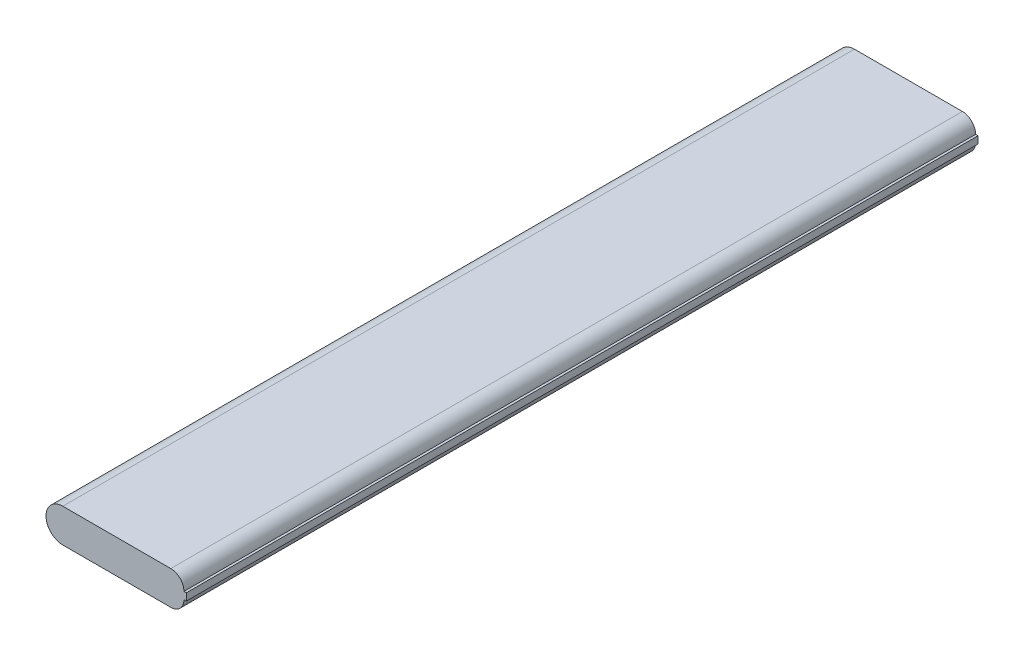
ISO-10303-21;
HEADER;
FILE_DESCRIPTION(('STEP AP214'),'2;1');
FILE_NAME('part.step','',(''),(''),'','','');
FILE_SCHEMA(('AUTOMOTIVE_DESIGN { 1 0 10303 214 1 1 1 1 }'));
ENDSEC;
DATA;
#1=APPLICATION_CONTEXT('core data for automotive mechanical design processes');
#2=APPLICATION_PROTOCOL_DEFINITION('international standard','automotive_design',2000,#1);
#3=PRODUCT_CONTEXT('',#1,'mechanical');
#4=PRODUCT('Part','Part','',(#3));
#5=PRODUCT_RELATED_PRODUCT_CATEGORY('part','',(#4));
#6=PRODUCT_DEFINITION_FORMATION('','',#4);
#7=PRODUCT_DEFINITION_CONTEXT('part definition',#1,'design');
#8=PRODUCT_DEFINITION('design','',#6,#7);
#9=PRODUCT_DEFINITION_SHAPE('','',#8);
#10=(LENGTH_UNIT() NAMED_UNIT(*) SI_UNIT(.MILLI.,.METRE.));
#11=(NAMED_UNIT(*) PLANE_ANGLE_UNIT() SI_UNIT($,.RADIAN.));
#12=(NAMED_UNIT(*) SI_UNIT($,.STERADIAN.) SOLID_ANGLE_UNIT());
#13=UNCERTAINTY_MEASURE_WITH_UNIT(LENGTH_MEASURE(1.E-05),#10,'distance_accuracy_value','');
#14=(GEOMETRIC_REPRESENTATION_CONTEXT(3) GLOBAL_UNCERTAINTY_ASSIGNED_CONTEXT((#13)) GLOBAL_UNIT_ASSIGNED_CONTEXT((#10,
#11,#12)) REPRESENTATION_CONTEXT('',''));
#15=CARTESIAN_POINT('',(0.,0.,0.));
#16=DIRECTION('',(0.,0.,1.));
#17=DIRECTION('',(1.,0.,0.));
#18=AXIS2_PLACEMENT_3D('',#15,#16,#17);
#19=CARTESIAN_POINT('',(-11.25,0.,82.5));
#20=DIRECTION('',(0.,0.,-1.));
#21=DIRECTION('',(-1.,0.,0.));
#22=AXIS2_PLACEMENT_3D('',#19,#20,#21);
#23=CYLINDRICAL_SURFACE('',#22,3.5);
#24=CARTESIAN_POINT('',(-11.25,0.,-82.5));
#25=DIRECTION('',(0.,0.,1.));
#26=DIRECTION('',(1.,0.,0.));
#27=AXIS2_PLACEMENT_3D('',#24,#25,#26);
#28=CIRCLE('',#27,3.5);
#29=CARTESIAN_POINT('',(-11.25,3.5,-82.5));
#30=VERTEX_POINT('',#29);
#31=CARTESIAN_POINT('',(-11.25,-3.5,-82.5));
#32=VERTEX_POINT('',#31);
#33=EDGE_CURVE('E130',#30,#32,#28,.T.);
#34=ORIENTED_EDGE('',*,*,#33,.T.);
#35=DIRECTION('',(0.,0.,-1.));
#36=VECTOR('',#35,1.);
#37=CARTESIAN_POINT('',(-11.25,-3.5,82.5));
#38=LINE('',#37,#36);
#39=CARTESIAN_POINT('',(-11.25,-3.5,82.5));
#40=VERTEX_POINT('',#39);
#41=EDGE_CURVE('E11',#40,#32,#38,.T.);
#42=ORIENTED_EDGE('',*,*,#41,.F.);
#43=CARTESIAN_POINT('',(-11.25,0.,82.5));
#44=DIRECTION('',(0.,0.,1.));
#45=DIRECTION('',(1.,0.,0.));
#46=AXIS2_PLACEMENT_3D('',#43,#44,#45);
#47=CIRCLE('',#46,3.5);
#48=CARTESIAN_POINT('',(-11.25,3.5,82.5));
#49=VERTEX_POINT('',#48);
#50=EDGE_CURVE('E144',#49,#40,#47,.T.);
#51=ORIENTED_EDGE('',*,*,#50,.F.);
#52=DIRECTION('',(0.,0.,-1.));
#53=VECTOR('',#52,1.);
#54=CARTESIAN_POINT('',(-11.25,3.5,82.5));
#55=LINE('',#54,#53);
#56=EDGE_CURVE('E126',#49,#30,#55,.T.);
#57=ORIENTED_EDGE('',*,*,#56,.T.);
#58=EDGE_LOOP('',(#34,#42,#51,#57));
#59=FACE_BOUND('',#58,.T.);
#60=ADVANCED_FACE('F34',(#59),#23,.T.);
#61=CARTESIAN_POINT('',(-11.25,-3.5,82.5));
#62=DIRECTION('',(0.,1.,0.));
#63=DIRECTION('',(0.,0.,1.));
#64=AXIS2_PLACEMENT_3D('',#61,#62,#63);
#65=PLANE('',#64);
#66=DIRECTION('',(1.,0.,0.));
#67=VECTOR('',#66,1.);
#68=CARTESIAN_POINT('',(-11.25,-3.5,-82.5));
#69=LINE('',#68,#67);
#70=CARTESIAN_POINT('',(11.25,-3.5,-82.5));
#71=VERTEX_POINT('',#70);
#72=EDGE_CURVE('E133',#32,#71,#69,.T.);
#73=ORIENTED_EDGE('',*,*,#72,.T.);
#74=DIRECTION('',(0.,0.,-1.));
#75=VECTOR('',#74,1.);
#76=CARTESIAN_POINT('',(11.25,-3.5,82.5));
#77=LINE('',#76,#75);
#78=CARTESIAN_POINT('',(11.25,-3.5,82.5));
#79=VERTEX_POINT('',#78);
#80=EDGE_CURVE('E42',#79,#71,#77,.T.);
#81=ORIENTED_EDGE('',*,*,#80,.F.);
#82=DIRECTION('',(1.,0.,0.));
#83=VECTOR('',#82,1.);
#84=CARTESIAN_POINT('',(-11.25,-3.5,82.5));
#85=LINE('',#84,#83);
#86=EDGE_CURVE('E93',#40,#79,#85,.T.);
#87=ORIENTED_EDGE('',*,*,#86,.F.);
#88=ORIENTED_EDGE('',*,*,#41,.T.);
#89=EDGE_LOOP('',(#73,#81,#87,#88));
#90=FACE_BOUND('',#89,.T.);
#91=ADVANCED_FACE('F179',(#90),#65,.F.);
#92=CARTESIAN_POINT('',(11.25,-0.75,82.5));
#93=DIRECTION('',(0.,0.,-1.));
#94=DIRECTION('',(-1.,0.,0.));
#95=AXIS2_PLACEMENT_3D('',#92,#93,#94);
#96=CYLINDRICAL_SURFACE('',#95,2.75);
#97=CARTESIAN_POINT('',(11.25,-0.75,-82.5));
#98=DIRECTION('',(0.,0.,1.));
#99=DIRECTION('',(1.,0.,0.));
#100=AXIS2_PLACEMENT_3D('',#97,#98,#99);
#101=CIRCLE('',#100,2.75);
#102=CARTESIAN_POINT('',(14.,-0.75,-82.5));
#103=VERTEX_POINT('',#102);
#104=EDGE_CURVE('E135',#71,#103,#101,.T.);
#105=ORIENTED_EDGE('',*,*,#104,.T.);
#106=DIRECTION('',(0.,0.,-1.));
#107=VECTOR('',#106,1.);
#108=CARTESIAN_POINT('',(14.,-0.75,82.5));
#109=LINE('',#108,#107);
#110=CARTESIAN_POINT('',(14.,-0.75,82.5));
#111=VERTEX_POINT('',#110);
#112=EDGE_CURVE('E151',#111,#103,#109,.T.);
#113=ORIENTED_EDGE('',*,*,#112,.F.);
#114=CARTESIAN_POINT('',(11.25,-0.75,82.5));
#115=DIRECTION('',(0.,0.,1.));
#116=DIRECTION('',(1.,0.,0.));
#117=AXIS2_PLACEMENT_3D('',#114,#115,#116);
#118=CIRCLE('',#117,2.75);
#119=EDGE_CURVE('E159',#79,#111,#118,.T.);
#120=ORIENTED_EDGE('',*,*,#119,.F.);
#121=ORIENTED_EDGE('',*,*,#80,.T.);
#122=EDGE_LOOP('',(#105,#113,#120,#121));
#123=FACE_BOUND('',#122,.T.);
#124=ADVANCED_FACE('F157',(#123),#96,.T.);
#125=CARTESIAN_POINT('',(14.,-0.75,82.5));
#126=DIRECTION('',(0.,1.,0.));
#127=DIRECTION('',(-1.,0.,0.));
#128=AXIS2_PLACEMENT_3D('',#125,#126,#127);
#129=PLANE('',#128);
#130=DIRECTION('',(1.,0.,0.));
#131=VECTOR('',#130,1.);
#132=CARTESIAN_POINT('',(14.,-0.75,-82.5));
#133=LINE('',#132,#131);
#134=CARTESIAN_POINT('',(14.5,-0.75,-82.5));
#135=VERTEX_POINT('',#134);
#136=EDGE_CURVE('E137',#103,#135,#133,.T.);
#137=ORIENTED_EDGE('',*,*,#136,.T.);
#138=DIRECTION('',(0.,0.,-1.));
#139=VECTOR('',#138,1.);
#140=CARTESIAN_POINT('',(14.5,-0.75,82.5));
#141=LINE('',#140,#139);
#142=CARTESIAN_POINT('',(14.5,-0.75,82.5));
#143=VERTEX_POINT('',#142);
#144=EDGE_CURVE('E148',#143,#135,#141,.T.);
#145=ORIENTED_EDGE('',*,*,#144,.F.);
#146=DIRECTION('',(1.,0.,0.));
#147=VECTOR('',#146,1.);
#148=CARTESIAN_POINT('',(14.,-0.75,82.5));
#149=LINE('',#148,#147);
#150=EDGE_CURVE('E171',#111,#143,#149,.T.);
#151=ORIENTED_EDGE('',*,*,#150,.F.);
#152=ORIENTED_EDGE('',*,*,#112,.T.);
#153=EDGE_LOOP('',(#137,#145,#151,#152));
#154=FACE_BOUND('',#153,.T.);
#155=ADVANCED_FACE('F167',(#154),#129,.F.);
#156=CARTESIAN_POINT('',(14.5,0.75,82.5));
#157=DIRECTION('',(-1.,0.,0.));
#158=DIRECTION('',(0.,0.,1.));
#159=AXIS2_PLACEMENT_3D('',#156,#157,#158);
#160=PLANE('',#159);
#161=DIRECTION('',(0.,1.,0.));
#162=VECTOR('',#161,1.);
#163=CARTESIAN_POINT('',(14.5,0.75,-82.5));
#164=LINE('',#163,#162);
#165=CARTESIAN_POINT('',(14.5,0.75,-82.5));
#166=VERTEX_POINT('',#165);
#167=EDGE_CURVE('E139',#135,#166,#164,.T.);
#168=ORIENTED_EDGE('',*,*,#167,.T.);
#169=DIRECTION('',(0.,0.,-1.));
#170=VECTOR('',#169,1.);
#171=CARTESIAN_POINT('',(14.5,0.75,82.5));
#172=LINE('',#171,#170);
#173=CARTESIAN_POINT('',(14.5,0.75,82.5));
#174=VERTEX_POINT('',#173);
#175=EDGE_CURVE('E121',#174,#166,#172,.T.);
#176=ORIENTED_EDGE('',*,*,#175,.F.);
#177=DIRECTION('',(0.,1.,0.));
#178=VECTOR('',#177,1.);
#179=CARTESIAN_POINT('',(14.5,0.75,82.5));
#180=LINE('',#179,#178);
#181=EDGE_CURVE('E112',#143,#174,#180,.T.);
#182=ORIENTED_EDGE('',*,*,#181,.F.);
#183=ORIENTED_EDGE('',*,*,#144,.T.);
#184=EDGE_LOOP('',(#168,#176,#182,#183));
#185=FACE_BOUND('',#184,.T.);
#186=ADVANCED_FACE('F170',(#185),#160,.F.);
#187=CARTESIAN_POINT('',(14.,0.75,82.5));
#188=DIRECTION('',(0.,-1.,0.));
#189=DIRECTION('',(1.,0.,0.));
#190=AXIS2_PLACEMENT_3D('',#187,#188,#189);
#191=PLANE('',#190);
#192=DIRECTION('',(-1.,0.,0.));
#193=VECTOR('',#192,1.);
#194=CARTESIAN_POINT('',(14.,0.75,-82.5));
#195=LINE('',#194,#193);
#196=CARTESIAN_POINT('',(14.,0.75,-82.5));
#197=VERTEX_POINT('',#196);
#198=EDGE_CURVE('E120',#166,#197,#195,.T.);
#199=ORIENTED_EDGE('',*,*,#198,.T.);
#200=DIRECTION('',(0.,0.,-1.));
#201=VECTOR('',#200,1.);
#202=CARTESIAN_POINT('',(14.,0.75,82.5));
#203=LINE('',#202,#201);
#204=CARTESIAN_POINT('',(14.,0.75,82.5));
#205=VERTEX_POINT('',#204);
#206=EDGE_CURVE('E117',#205,#197,#203,.T.);
#207=ORIENTED_EDGE('',*,*,#206,.F.);
#208=DIRECTION('',(-1.,0.,0.));
#209=VECTOR('',#208,1.);
#210=CARTESIAN_POINT('',(14.,0.75,82.5));
#211=LINE('',#210,#209);
#212=EDGE_CURVE('E106',#174,#205,#211,.T.);
#213=ORIENTED_EDGE('',*,*,#212,.F.);
#214=ORIENTED_EDGE('',*,*,#175,.T.);
#215=EDGE_LOOP('',(#199,#207,#213,#214));
#216=FACE_BOUND('',#215,.T.);
#217=ADVANCED_FACE('F118',(#216),#191,.F.);
#218=CARTESIAN_POINT('',(11.25,0.75,82.5));
#219=DIRECTION('',(0.,0.,-1.));
#220=DIRECTION('',(-1.,0.,0.));
#221=AXIS2_PLACEMENT_3D('',#218,#219,#220);
#222=CYLINDRICAL_SURFACE('',#221,2.75);
#223=CARTESIAN_POINT('',(11.25,0.75,-82.5));
#224=DIRECTION('',(0.,0.,1.));
#225=DIRECTION('',(-1.,0.,0.));
#226=AXIS2_PLACEMENT_3D('',#223,#224,#225);
#227=CIRCLE('',#226,2.75);
#228=CARTESIAN_POINT('',(11.25,3.5,-82.5));
#229=VERTEX_POINT('',#228);
#230=EDGE_CURVE('E79',#197,#229,#227,.T.);
#231=ORIENTED_EDGE('',*,*,#230,.T.);
#232=DIRECTION('',(0.,0.,-1.));
#233=VECTOR('',#232,1.);
#234=CARTESIAN_POINT('',(11.25,3.5,82.5));
#235=LINE('',#234,#233);
#236=CARTESIAN_POINT('',(11.25,3.5,82.5));
#237=VERTEX_POINT('',#236);
#238=EDGE_CURVE('E122',#237,#229,#235,.T.);
#239=ORIENTED_EDGE('',*,*,#238,.F.);
#240=CARTESIAN_POINT('',(11.25,0.75,82.5));
#241=DIRECTION('',(0.,0.,1.));
#242=DIRECTION('',(-1.,0.,0.));
#243=AXIS2_PLACEMENT_3D('',#240,#241,#242);
#244=CIRCLE('',#243,2.75);
#245=EDGE_CURVE('E110',#205,#237,#244,.T.);
#246=ORIENTED_EDGE('',*,*,#245,.F.);
#247=ORIENTED_EDGE('',*,*,#206,.T.);
#248=EDGE_LOOP('',(#231,#239,#246,#247));
#249=FACE_BOUND('',#248,.T.);
#250=ADVANCED_FACE('F124',(#249),#222,.T.);
#251=CARTESIAN_POINT('',(-11.25,3.5,82.5));
#252=DIRECTION('',(0.,-1.,0.));
#253=DIRECTION('',(0.,0.,-1.));
#254=AXIS2_PLACEMENT_3D('',#251,#252,#253);
#255=PLANE('',#254);
#256=DIRECTION('',(-1.,0.,0.));
#257=VECTOR('',#256,1.);
#258=CARTESIAN_POINT('',(-11.25,3.5,-82.5));
#259=LINE('',#258,#257);
#260=EDGE_CURVE('E85',#229,#30,#259,.T.);
#261=ORIENTED_EDGE('',*,*,#260,.T.);
#262=ORIENTED_EDGE('',*,*,#56,.F.);
#263=DIRECTION('',(-1.,0.,0.));
#264=VECTOR('',#263,1.);
#265=CARTESIAN_POINT('',(-11.25,3.5,82.5));
#266=LINE('',#265,#264);
#267=EDGE_CURVE('E50',#237,#49,#266,.T.);
#268=ORIENTED_EDGE('',*,*,#267,.F.);
#269=ORIENTED_EDGE('',*,*,#238,.T.);
#270=EDGE_LOOP('',(#261,#262,#268,#269));
#271=FACE_BOUND('',#270,.T.);
#272=ADVANCED_FACE('F195',(#271),#255,.F.);
#273=CARTESIAN_POINT('',(-11.25,0.,82.5));
#274=DIRECTION('',(0.,0.,1.));
#275=DIRECTION('',(1.,0.,0.));
#276=AXIS2_PLACEMENT_3D('',#273,#274,#275);
#277=PLANE('',#276);
#278=ORIENTED_EDGE('',*,*,#50,.T.);
#279=ORIENTED_EDGE('',*,*,#86,.T.);
#280=ORIENTED_EDGE('',*,*,#119,.T.);
#281=ORIENTED_EDGE('',*,*,#150,.T.);
#282=ORIENTED_EDGE('',*,*,#181,.T.);
#283=ORIENTED_EDGE('',*,*,#212,.T.);
#284=ORIENTED_EDGE('',*,*,#245,.T.);
#285=ORIENTED_EDGE('',*,*,#267,.T.);
#286=EDGE_LOOP('',(#278,#279,#280,#281,#282,#283,#284,#285));
#287=FACE_BOUND('',#286,.T.);
#288=ADVANCED_FACE('F108',(#287),#277,.T.);
#289=CARTESIAN_POINT('',(-11.25,0.,-82.5));
#290=DIRECTION('',(0.,0.,1.));
#291=DIRECTION('',(1.,0.,0.));
#292=AXIS2_PLACEMENT_3D('',#289,#290,#291);
#293=PLANE('',#292);
#294=ORIENTED_EDGE('',*,*,#33,.F.);
#295=ORIENTED_EDGE('',*,*,#260,.F.);
#296=ORIENTED_EDGE('',*,*,#230,.F.);
#297=ORIENTED_EDGE('',*,*,#198,.F.);
#298=ORIENTED_EDGE('',*,*,#167,.F.);
#299=ORIENTED_EDGE('',*,*,#136,.F.);
#300=ORIENTED_EDGE('',*,*,#104,.F.);
#301=ORIENTED_EDGE('',*,*,#72,.F.);
#302=EDGE_LOOP('',(#294,#295,#296,#297,#298,#299,#300,#301));
#303=FACE_BOUND('',#302,.T.);
#304=ADVANCED_FACE('F163',(#303),#293,.F.);
#305=CLOSED_SHELL('',(#60,#91,#124,#155,#186,#217,#250,#272,#288,#304));
#306=MANIFOLD_SOLID_BREP('B2',#305);
#307=ADVANCED_BREP_SHAPE_REPRESENTATION('',(#18,#306),#14);
#308=SHAPE_DEFINITION_REPRESENTATION(#9,#307);
ENDSEC;
END-ISO-10303-21;
